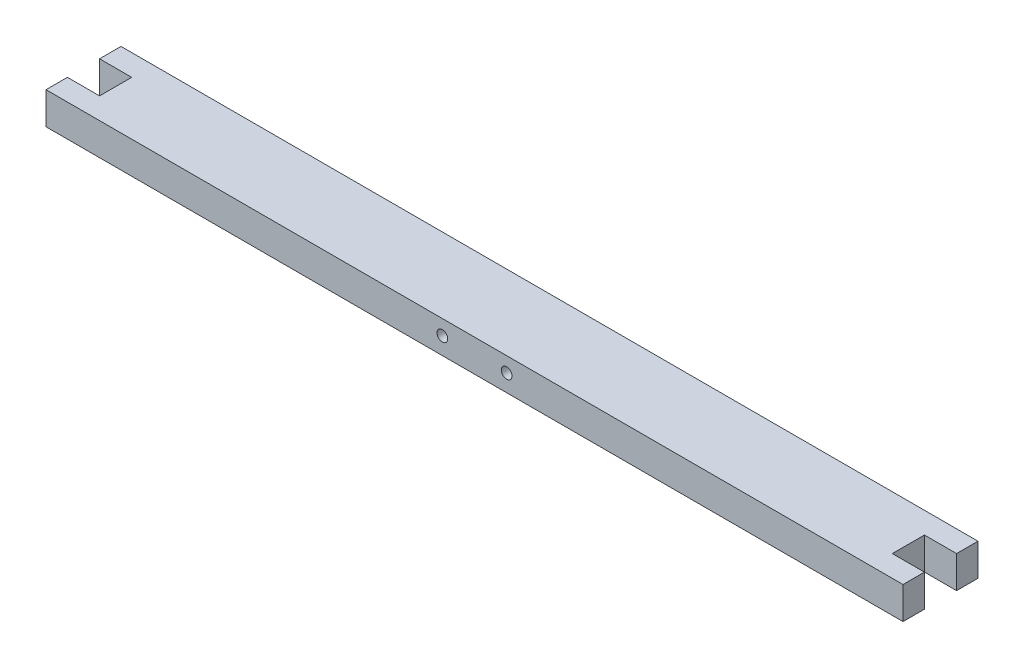
ISO-10303-21;
HEADER;
FILE_DESCRIPTION(('STEP AP214'),'2;1');
FILE_NAME('part.step','',(''),(''),'','','');
FILE_SCHEMA(('AUTOMOTIVE_DESIGN { 1 0 10303 214 1 1 1 1 }'));
ENDSEC;
DATA;
#1=APPLICATION_CONTEXT('core data for automotive mechanical design processes');
#2=APPLICATION_PROTOCOL_DEFINITION('international standard','automotive_design',2000,#1);
#3=PRODUCT_CONTEXT('',#1,'mechanical');
#4=PRODUCT('Part','Part','',(#3));
#5=PRODUCT_RELATED_PRODUCT_CATEGORY('part','',(#4));
#6=PRODUCT_DEFINITION_FORMATION('','',#4);
#7=PRODUCT_DEFINITION_CONTEXT('part definition',#1,'design');
#8=PRODUCT_DEFINITION('design','',#6,#7);
#9=PRODUCT_DEFINITION_SHAPE('','',#8);
#10=(LENGTH_UNIT() NAMED_UNIT(*) SI_UNIT(.MILLI.,.METRE.));
#11=(NAMED_UNIT(*) PLANE_ANGLE_UNIT() SI_UNIT($,.RADIAN.));
#12=(NAMED_UNIT(*) SI_UNIT($,.STERADIAN.) SOLID_ANGLE_UNIT());
#13=UNCERTAINTY_MEASURE_WITH_UNIT(LENGTH_MEASURE(1.E-05),#10,'distance_accuracy_value','');
#14=(GEOMETRIC_REPRESENTATION_CONTEXT(3) GLOBAL_UNCERTAINTY_ASSIGNED_CONTEXT((#13)) GLOBAL_UNIT_ASSIGNED_CONTEXT((#10,
#11,#12)) REPRESENTATION_CONTEXT('',''));
#15=CARTESIAN_POINT('',(0.,0.,0.));
#16=DIRECTION('',(0.,0.,1.));
#17=DIRECTION('',(1.,0.,0.));
#18=AXIS2_PLACEMENT_3D('',#15,#16,#17);
#19=CARTESIAN_POINT('',(0.,15.,-25.));
#20=DIRECTION('',(-1.,0.,0.));
#21=DIRECTION('',(0.,0.,1.));
#22=AXIS2_PLACEMENT_3D('',#19,#20,#21);
#23=PLANE('',#22);
#24=DIRECTION('',(0.,0.,-1.));
#25=VECTOR('',#24,1.);
#26=CARTESIAN_POINT('',(0.,0.,-25.));
#27=LINE('',#26,#25);
#28=CARTESIAN_POINT('',(0.,0.,-25.));
#29=VERTEX_POINT('',#28);
#30=CARTESIAN_POINT('',(0.,0.,-35.));
#31=VERTEX_POINT('',#30);
#32=EDGE_CURVE('E157',#29,#31,#27,.T.);
#33=ORIENTED_EDGE('',*,*,#32,.F.);
#34=DIRECTION('',(0.,-1.,0.));
#35=VECTOR('',#34,1.);
#36=CARTESIAN_POINT('',(0.,15.,-25.));
#37=LINE('',#36,#35);
#38=CARTESIAN_POINT('',(0.,15.,-25.));
#39=VERTEX_POINT('',#38);
#40=EDGE_CURVE('E11',#39,#29,#37,.T.);
#41=ORIENTED_EDGE('',*,*,#40,.F.);
#42=DIRECTION('',(0.,0.,-1.));
#43=VECTOR('',#42,1.);
#44=CARTESIAN_POINT('',(0.,15.,-25.));
#45=LINE('',#44,#43);
#46=CARTESIAN_POINT('',(0.,15.,-35.));
#47=VERTEX_POINT('',#46);
#48=EDGE_CURVE('E186',#39,#47,#45,.T.);
#49=ORIENTED_EDGE('',*,*,#48,.T.);
#50=DIRECTION('',(0.,-1.,0.));
#51=VECTOR('',#50,1.);
#52=CARTESIAN_POINT('',(0.,15.,-35.));
#53=LINE('',#52,#51);
#54=EDGE_CURVE('E38',#47,#31,#53,.T.);
#55=ORIENTED_EDGE('',*,*,#54,.T.);
#56=EDGE_LOOP('',(#33,#41,#49,#55));
#57=FACE_BOUND('',#56,.T.);
#58=ADVANCED_FACE('F35',(#57),#23,.T.);
#59=CARTESIAN_POINT('',(0.,15.,-25.));
#60=DIRECTION('',(0.,0.,-1.));
#61=DIRECTION('',(-1.,0.,0.));
#62=AXIS2_PLACEMENT_3D('',#59,#60,#61);
#63=PLANE('',#62);
#64=DIRECTION('',(1.,0.,0.));
#65=VECTOR('',#64,1.);
#66=CARTESIAN_POINT('',(0.,0.,-25.));
#67=LINE('',#66,#65);
#68=CARTESIAN_POINT('',(15.,0.,-25.));
#69=VERTEX_POINT('',#68);
#70=EDGE_CURVE('E185',#29,#69,#67,.T.);
#71=ORIENTED_EDGE('',*,*,#70,.T.);
#72=DIRECTION('',(0.,-1.,0.));
#73=VECTOR('',#72,1.);
#74=CARTESIAN_POINT('',(15.,15.,-25.));
#75=LINE('',#74,#73);
#76=CARTESIAN_POINT('',(15.,15.,-25.));
#77=VERTEX_POINT('',#76);
#78=EDGE_CURVE('E44',#77,#69,#75,.T.);
#79=ORIENTED_EDGE('',*,*,#78,.F.);
#80=DIRECTION('',(1.,0.,0.));
#81=VECTOR('',#80,1.);
#82=CARTESIAN_POINT('',(0.,15.,-25.));
#83=LINE('',#82,#81);
#84=EDGE_CURVE('E147',#39,#77,#83,.T.);
#85=ORIENTED_EDGE('',*,*,#84,.F.);
#86=ORIENTED_EDGE('',*,*,#40,.T.);
#87=EDGE_LOOP('',(#71,#79,#85,#86));
#88=FACE_BOUND('',#87,.T.);
#89=ADVANCED_FACE('F210',(#88),#63,.F.);
#90=CARTESIAN_POINT('',(15.,15.,-10.));
#91=DIRECTION('',(-1.,0.,0.));
#92=DIRECTION('',(0.,0.,1.));
#93=AXIS2_PLACEMENT_3D('',#90,#91,#92);
#94=PLANE('',#93);
#95=DIRECTION('',(0.,0.,-1.));
#96=VECTOR('',#95,1.);
#97=CARTESIAN_POINT('',(15.,0.,-10.));
#98=LINE('',#97,#96);
#99=CARTESIAN_POINT('',(15.,0.,-10.));
#100=VERTEX_POINT('',#99);
#101=EDGE_CURVE('E133',#100,#69,#98,.T.);
#102=ORIENTED_EDGE('',*,*,#101,.F.);
#103=DIRECTION('',(0.,-1.,0.));
#104=VECTOR('',#103,1.);
#105=CARTESIAN_POINT('',(15.,15.,-10.));
#106=LINE('',#105,#104);
#107=CARTESIAN_POINT('',(15.,15.,-10.));
#108=VERTEX_POINT('',#107);
#109=EDGE_CURVE('E128',#108,#100,#106,.T.);
#110=ORIENTED_EDGE('',*,*,#109,.F.);
#111=DIRECTION('',(0.,0.,-1.));
#112=VECTOR('',#111,1.);
#113=CARTESIAN_POINT('',(15.,15.,-10.));
#114=LINE('',#113,#112);
#115=EDGE_CURVE('E131',#108,#77,#114,.T.);
#116=ORIENTED_EDGE('',*,*,#115,.T.);
#117=ORIENTED_EDGE('',*,*,#78,.T.);
#118=EDGE_LOOP('',(#102,#110,#116,#117));
#119=FACE_BOUND('',#118,.T.);
#120=ADVANCED_FACE('F130',(#119),#94,.T.);
#121=CARTESIAN_POINT('',(0.,15.,-10.));
#122=DIRECTION('',(0.,0.,-1.));
#123=DIRECTION('',(-1.,0.,0.));
#124=AXIS2_PLACEMENT_3D('',#121,#122,#123);
#125=PLANE('',#124);
#126=DIRECTION('',(1.,0.,0.));
#127=VECTOR('',#126,1.);
#128=CARTESIAN_POINT('',(0.,0.,-10.));
#129=LINE('',#128,#127);
#130=CARTESIAN_POINT('',(0.,0.,-10.));
#131=VERTEX_POINT('',#130);
#132=EDGE_CURVE('E182',#131,#100,#129,.T.);
#133=ORIENTED_EDGE('',*,*,#132,.F.);
#134=DIRECTION('',(0.,-1.,0.));
#135=VECTOR('',#134,1.);
#136=CARTESIAN_POINT('',(0.,15.,-10.));
#137=LINE('',#136,#135);
#138=CARTESIAN_POINT('',(0.,15.,-10.));
#139=VERTEX_POINT('',#138);
#140=EDGE_CURVE('E138',#139,#131,#137,.T.);
#141=ORIENTED_EDGE('',*,*,#140,.F.);
#142=DIRECTION('',(1.,0.,0.));
#143=VECTOR('',#142,1.);
#144=CARTESIAN_POINT('',(0.,15.,-10.));
#145=LINE('',#144,#143);
#146=EDGE_CURVE('E145',#139,#108,#145,.T.);
#147=ORIENTED_EDGE('',*,*,#146,.T.);
#148=ORIENTED_EDGE('',*,*,#109,.T.);
#149=EDGE_LOOP('',(#133,#141,#147,#148));
#150=FACE_BOUND('',#149,.T.);
#151=ADVANCED_FACE('F149',(#150),#125,.T.);
#152=CARTESIAN_POINT('',(0.,15.,0.));
#153=DIRECTION('',(-1.,0.,0.));
#154=DIRECTION('',(0.,0.,1.));
#155=AXIS2_PLACEMENT_3D('',#152,#153,#154);
#156=PLANE('',#155);
#157=DIRECTION('',(0.,0.,-1.));
#158=VECTOR('',#157,1.);
#159=CARTESIAN_POINT('',(0.,0.,0.));
#160=LINE('',#159,#158);
#161=CARTESIAN_POINT('',(0.,0.,0.));
#162=VERTEX_POINT('',#161);
#163=EDGE_CURVE('E179',#162,#131,#160,.T.);
#164=ORIENTED_EDGE('',*,*,#163,.F.);
#165=DIRECTION('',(0.,-1.,0.));
#166=VECTOR('',#165,1.);
#167=CARTESIAN_POINT('',(0.,15.,0.));
#168=LINE('',#167,#166);
#169=CARTESIAN_POINT('',(0.,15.,0.));
#170=VERTEX_POINT('',#169);
#171=EDGE_CURVE('E190',#170,#162,#168,.T.);
#172=ORIENTED_EDGE('',*,*,#171,.F.);
#173=DIRECTION('',(0.,0.,-1.));
#174=VECTOR('',#173,1.);
#175=CARTESIAN_POINT('',(0.,15.,0.));
#176=LINE('',#175,#174);
#177=EDGE_CURVE('E150',#170,#139,#176,.T.);
#178=ORIENTED_EDGE('',*,*,#177,.T.);
#179=ORIENTED_EDGE('',*,*,#140,.T.);
#180=EDGE_LOOP('',(#164,#172,#178,#179));
#181=FACE_BOUND('',#180,.T.);
#182=ADVANCED_FACE('F257',(#181),#156,.T.);
#183=CARTESIAN_POINT('',(0.,15.,0.));
#184=DIRECTION('',(0.,0.,-1.));
#185=DIRECTION('',(-1.,0.,0.));
#186=AXIS2_PLACEMENT_3D('',#183,#184,#185);
#187=PLANE('',#186);
#188=CARTESIAN_POINT('',(185.,8.00000000000001,0.));
#189=DIRECTION('',(0.,0.,1.));
#190=DIRECTION('',(1.,0.,0.));
#191=AXIS2_PLACEMENT_3D('',#188,#189,#190);
#192=CIRCLE('',#191,2.5);
#193=CARTESIAN_POINT('',(187.5,8.00000000000001,0.));
#194=VERTEX_POINT('',#193);
#195=EDGE_CURVE('E295',#194,#194,#192,.T.);
#196=ORIENTED_EDGE('',*,*,#195,.F.);
#197=EDGE_LOOP('',(#196));
#198=FACE_BOUND('',#197,.T.);
#199=CARTESIAN_POINT('',(215.,8.00000000000001,0.));
#200=DIRECTION('',(0.,0.,1.));
#201=DIRECTION('',(1.,0.,0.));
#202=AXIS2_PLACEMENT_3D('',#199,#200,#201);
#203=CIRCLE('',#202,2.50000000000002);
#204=CARTESIAN_POINT('',(217.5,8.00000000000001,0.));
#205=VERTEX_POINT('',#204);
#206=EDGE_CURVE('E216',#205,#205,#203,.T.);
#207=ORIENTED_EDGE('',*,*,#206,.F.);
#208=EDGE_LOOP('',(#207));
#209=FACE_BOUND('',#208,.T.);
#210=DIRECTION('',(1.,0.,0.));
#211=VECTOR('',#210,1.);
#212=CARTESIAN_POINT('',(0.,0.,0.));
#213=LINE('',#212,#211);
#214=CARTESIAN_POINT('',(400.,0.,1.01307850997046E-13));
#215=VERTEX_POINT('',#214);
#216=EDGE_CURVE('E177',#162,#215,#213,.T.);
#217=ORIENTED_EDGE('',*,*,#216,.T.);
#218=DIRECTION('',(0.,-1.,0.));
#219=VECTOR('',#218,1.);
#220=CARTESIAN_POINT('',(400.,15.,1.01307850997046E-13));
#221=LINE('',#220,#219);
#222=CARTESIAN_POINT('',(400.,15.,1.01307850997046E-13));
#223=VERTEX_POINT('',#222);
#224=EDGE_CURVE('E192',#223,#215,#221,.T.);
#225=ORIENTED_EDGE('',*,*,#224,.F.);
#226=DIRECTION('',(1.,0.,0.));
#227=VECTOR('',#226,1.);
#228=CARTESIAN_POINT('',(0.,15.,0.));
#229=LINE('',#228,#227);
#230=EDGE_CURVE('E152',#170,#223,#229,.T.);
#231=ORIENTED_EDGE('',*,*,#230,.F.);
#232=ORIENTED_EDGE('',*,*,#171,.T.);
#233=EDGE_LOOP('',(#217,#225,#231,#232));
#234=FACE_BOUND('',#233,.T.);
#235=ADVANCED_FACE('F233',(#198,#209,#234),#187,.F.);
#236=CARTESIAN_POINT('',(400.,15.,1.01307850997046E-13));
#237=DIRECTION('',(-1.,0.,0.));
#238=DIRECTION('',(0.,0.,1.));
#239=AXIS2_PLACEMENT_3D('',#236,#237,#238);
#240=PLANE('',#239);
#241=DIRECTION('',(0.,0.,-1.));
#242=VECTOR('',#241,1.);
#243=CARTESIAN_POINT('',(400.,0.,1.01307850997046E-13));
#244=LINE('',#243,#242);
#245=CARTESIAN_POINT('',(400.,0.,-9.9999999999999));
#246=VERTEX_POINT('',#245);
#247=EDGE_CURVE('E175',#215,#246,#244,.T.);
#248=ORIENTED_EDGE('',*,*,#247,.T.);
#249=DIRECTION('',(0.,-1.,0.));
#250=VECTOR('',#249,1.);
#251=CARTESIAN_POINT('',(400.,15.,-9.9999999999999));
#252=LINE('',#251,#250);
#253=CARTESIAN_POINT('',(400.,15.,-9.9999999999999));
#254=VERTEX_POINT('',#253);
#255=EDGE_CURVE('E195',#254,#246,#252,.T.);
#256=ORIENTED_EDGE('',*,*,#255,.F.);
#257=DIRECTION('',(0.,0.,-1.));
#258=VECTOR('',#257,1.);
#259=CARTESIAN_POINT('',(400.,15.,1.01307850997046E-13));
#260=LINE('',#259,#258);
#261=EDGE_CURVE('E227',#223,#254,#260,.T.);
#262=ORIENTED_EDGE('',*,*,#261,.F.);
#263=ORIENTED_EDGE('',*,*,#224,.T.);
#264=EDGE_LOOP('',(#248,#256,#262,#263));
#265=FACE_BOUND('',#264,.T.);
#266=ADVANCED_FACE('F237',(#265),#240,.F.);
#267=CARTESIAN_POINT('',(400.,15.,-9.9999999999999));
#268=DIRECTION('',(0.,0.,1.));
#269=DIRECTION('',(1.,0.,0.));
#270=AXIS2_PLACEMENT_3D('',#267,#268,#269);
#271=PLANE('',#270);
#272=DIRECTION('',(-1.,0.,0.));
#273=VECTOR('',#272,1.);
#274=CARTESIAN_POINT('',(400.,0.,-9.9999999999999));
#275=LINE('',#274,#273);
#276=CARTESIAN_POINT('',(385.,0.,-9.9999999999999));
#277=VERTEX_POINT('',#276);
#278=EDGE_CURVE('E173',#246,#277,#275,.T.);
#279=ORIENTED_EDGE('',*,*,#278,.T.);
#280=DIRECTION('',(0.,-1.,0.));
#281=VECTOR('',#280,1.);
#282=CARTESIAN_POINT('',(385.,15.,-9.9999999999999));
#283=LINE('',#282,#281);
#284=CARTESIAN_POINT('',(385.,15.,-9.9999999999999));
#285=VERTEX_POINT('',#284);
#286=EDGE_CURVE('E198',#285,#277,#283,.T.);
#287=ORIENTED_EDGE('',*,*,#286,.F.);
#288=DIRECTION('',(-1.,0.,0.));
#289=VECTOR('',#288,1.);
#290=CARTESIAN_POINT('',(400.,15.,-9.9999999999999));
#291=LINE('',#290,#289);
#292=EDGE_CURVE('E225',#254,#285,#291,.T.);
#293=ORIENTED_EDGE('',*,*,#292,.F.);
#294=ORIENTED_EDGE('',*,*,#255,.T.);
#295=EDGE_LOOP('',(#279,#287,#293,#294));
#296=FACE_BOUND('',#295,.T.);
#297=ADVANCED_FACE('F242',(#296),#271,.F.);
#298=CARTESIAN_POINT('',(385.,15.,-9.9999999999999));
#299=DIRECTION('',(-1.,0.,0.));
#300=DIRECTION('',(0.,0.,1.));
#301=AXIS2_PLACEMENT_3D('',#298,#299,#300);
#302=PLANE('',#301);
#303=DIRECTION('',(0.,0.,-1.));
#304=VECTOR('',#303,1.);
#305=CARTESIAN_POINT('',(385.,0.,-9.9999999999999));
#306=LINE('',#305,#304);
#307=CARTESIAN_POINT('',(385.,0.,-24.9999999999999));
#308=VERTEX_POINT('',#307);
#309=EDGE_CURVE('E170',#277,#308,#306,.T.);
#310=ORIENTED_EDGE('',*,*,#309,.T.);
#311=DIRECTION('',(0.,-1.,0.));
#312=VECTOR('',#311,1.);
#313=CARTESIAN_POINT('',(385.,15.,-24.9999999999999));
#314=LINE('',#313,#312);
#315=CARTESIAN_POINT('',(385.,15.,-24.9999999999999));
#316=VERTEX_POINT('',#315);
#317=EDGE_CURVE('E201',#316,#308,#314,.T.);
#318=ORIENTED_EDGE('',*,*,#317,.F.);
#319=DIRECTION('',(0.,0.,-1.));
#320=VECTOR('',#319,1.);
#321=CARTESIAN_POINT('',(385.,15.,-9.9999999999999));
#322=LINE('',#321,#320);
#323=EDGE_CURVE('E223',#285,#316,#322,.T.);
#324=ORIENTED_EDGE('',*,*,#323,.F.);
#325=ORIENTED_EDGE('',*,*,#286,.T.);
#326=EDGE_LOOP('',(#310,#318,#324,#325));
#327=FACE_BOUND('',#326,.T.);
#328=ADVANCED_FACE('F247',(#327),#302,.F.);
#329=CARTESIAN_POINT('',(400.,15.,-24.9999999999999));
#330=DIRECTION('',(0.,0.,1.));
#331=DIRECTION('',(1.,0.,0.));
#332=AXIS2_PLACEMENT_3D('',#329,#330,#331);
#333=PLANE('',#332);
#334=DIRECTION('',(-1.,0.,0.));
#335=VECTOR('',#334,1.);
#336=CARTESIAN_POINT('',(400.,0.,-24.9999999999999));
#337=LINE('',#336,#335);
#338=CARTESIAN_POINT('',(400.,0.,-24.9999999999999));
#339=VERTEX_POINT('',#338);
#340=EDGE_CURVE('E167',#339,#308,#337,.T.);
#341=ORIENTED_EDGE('',*,*,#340,.F.);
#342=DIRECTION('',(0.,-1.,0.));
#343=VECTOR('',#342,1.);
#344=CARTESIAN_POINT('',(400.,15.,-24.9999999999999));
#345=LINE('',#344,#343);
#346=CARTESIAN_POINT('',(400.,15.,-24.9999999999999));
#347=VERTEX_POINT('',#346);
#348=EDGE_CURVE('E203',#347,#339,#345,.T.);
#349=ORIENTED_EDGE('',*,*,#348,.F.);
#350=DIRECTION('',(-1.,0.,0.));
#351=VECTOR('',#350,1.);
#352=CARTESIAN_POINT('',(400.,15.,-24.9999999999999));
#353=LINE('',#352,#351);
#354=EDGE_CURVE('E220',#347,#316,#353,.T.);
#355=ORIENTED_EDGE('',*,*,#354,.T.);
#356=ORIENTED_EDGE('',*,*,#317,.T.);
#357=EDGE_LOOP('',(#341,#349,#355,#356));
#358=FACE_BOUND('',#357,.T.);
#359=ADVANCED_FACE('F251',(#358),#333,.T.);
#360=CARTESIAN_POINT('',(400.,15.,-24.9999999999999));
#361=DIRECTION('',(-1.,0.,0.));
#362=DIRECTION('',(0.,0.,1.));
#363=AXIS2_PLACEMENT_3D('',#360,#361,#362);
#364=PLANE('',#363);
#365=DIRECTION('',(0.,0.,-1.));
#366=VECTOR('',#365,1.);
#367=CARTESIAN_POINT('',(400.,0.,-24.9999999999999));
#368=LINE('',#367,#366);
#369=CARTESIAN_POINT('',(400.,0.,-34.9999999999999));
#370=VERTEX_POINT('',#369);
#371=EDGE_CURVE('E164',#339,#370,#368,.T.);
#372=ORIENTED_EDGE('',*,*,#371,.T.);
#373=DIRECTION('',(0.,-1.,0.));
#374=VECTOR('',#373,1.);
#375=CARTESIAN_POINT('',(400.,15.,-34.9999999999999));
#376=LINE('',#375,#374);
#377=CARTESIAN_POINT('',(400.,15.,-34.9999999999999));
#378=VERTEX_POINT('',#377);
#379=EDGE_CURVE('E204',#378,#370,#376,.T.);
#380=ORIENTED_EDGE('',*,*,#379,.F.);
#381=DIRECTION('',(0.,0.,-1.));
#382=VECTOR('',#381,1.);
#383=CARTESIAN_POINT('',(400.,15.,-24.9999999999999));
#384=LINE('',#383,#382);
#385=EDGE_CURVE('E213',#347,#378,#384,.T.);
#386=ORIENTED_EDGE('',*,*,#385,.F.);
#387=ORIENTED_EDGE('',*,*,#348,.T.);
#388=EDGE_LOOP('',(#372,#380,#386,#387));
#389=FACE_BOUND('',#388,.T.);
#390=ADVANCED_FACE('F254',(#389),#364,.F.);
#391=CARTESIAN_POINT('',(0.,15.,-35.));
#392=DIRECTION('',(0.,0.,-1.));
#393=DIRECTION('',(-1.,0.,0.));
#394=AXIS2_PLACEMENT_3D('',#391,#392,#393);
#395=PLANE('',#394);
#396=CARTESIAN_POINT('',(185.,8.00000000000001,-35.));
#397=DIRECTION('',(0.,0.,1.));
#398=DIRECTION('',(1.,0.,0.));
#399=AXIS2_PLACEMENT_3D('',#396,#397,#398);
#400=CIRCLE('',#399,2.5);
#401=CARTESIAN_POINT('',(187.5,8.00000000000001,-35.));
#402=VERTEX_POINT('',#401);
#403=EDGE_CURVE('E161',#402,#402,#400,.T.);
#404=ORIENTED_EDGE('',*,*,#403,.T.);
#405=EDGE_LOOP('',(#404));
#406=FACE_BOUND('',#405,.T.);
#407=CARTESIAN_POINT('',(215.,8.00000000000001,-35.));
#408=DIRECTION('',(0.,0.,1.));
#409=DIRECTION('',(1.,0.,0.));
#410=AXIS2_PLACEMENT_3D('',#407,#408,#409);
#411=CIRCLE('',#410,2.50000000000002);
#412=CARTESIAN_POINT('',(217.5,8.00000000000001,-35.));
#413=VERTEX_POINT('',#412);
#414=EDGE_CURVE('E296',#413,#413,#411,.T.);
#415=ORIENTED_EDGE('',*,*,#414,.T.);
#416=EDGE_LOOP('',(#415));
#417=FACE_BOUND('',#416,.T.);
#418=DIRECTION('',(1.,0.,0.));
#419=VECTOR('',#418,1.);
#420=CARTESIAN_POINT('',(0.,0.,-35.));
#421=LINE('',#420,#419);
#422=EDGE_CURVE('E160',#31,#370,#421,.T.);
#423=ORIENTED_EDGE('',*,*,#422,.F.);
#424=ORIENTED_EDGE('',*,*,#54,.F.);
#425=DIRECTION('',(1.,0.,0.));
#426=VECTOR('',#425,1.);
#427=CARTESIAN_POINT('',(0.,15.,-35.));
#428=LINE('',#427,#426);
#429=EDGE_CURVE('E211',#47,#378,#428,.T.);
#430=ORIENTED_EDGE('',*,*,#429,.T.);
#431=ORIENTED_EDGE('',*,*,#379,.T.);
#432=EDGE_LOOP('',(#423,#424,#430,#431));
#433=FACE_BOUND('',#432,.T.);
#434=ADVANCED_FACE('F206',(#406,#417,#433),#395,.T.);
#435=CARTESIAN_POINT('',(0.,15.,0.));
#436=DIRECTION('',(0.,-1.,0.));
#437=DIRECTION('',(0.,0.,-1.));
#438=AXIS2_PLACEMENT_3D('',#435,#436,#437);
#439=PLANE('',#438);
#440=ORIENTED_EDGE('',*,*,#48,.F.);
#441=ORIENTED_EDGE('',*,*,#84,.T.);
#442=ORIENTED_EDGE('',*,*,#115,.F.);
#443=ORIENTED_EDGE('',*,*,#146,.F.);
#444=ORIENTED_EDGE('',*,*,#177,.F.);
#445=ORIENTED_EDGE('',*,*,#230,.T.);
#446=ORIENTED_EDGE('',*,*,#261,.T.);
#447=ORIENTED_EDGE('',*,*,#292,.T.);
#448=ORIENTED_EDGE('',*,*,#323,.T.);
#449=ORIENTED_EDGE('',*,*,#354,.F.);
#450=ORIENTED_EDGE('',*,*,#385,.T.);
#451=ORIENTED_EDGE('',*,*,#429,.F.);
#452=EDGE_LOOP('',(#440,#441,#442,#443,#444,#445,#446,#447,#448,#449,#450,#451));
#453=FACE_BOUND('',#452,.T.);
#454=ADVANCED_FACE('F143',(#453),#439,.F.);
#455=CARTESIAN_POINT('',(0.,0.,0.));
#456=DIRECTION('',(0.,-1.,0.));
#457=DIRECTION('',(0.,0.,-1.));
#458=AXIS2_PLACEMENT_3D('',#455,#456,#457);
#459=PLANE('',#458);
#460=ORIENTED_EDGE('',*,*,#32,.T.);
#461=ORIENTED_EDGE('',*,*,#422,.T.);
#462=ORIENTED_EDGE('',*,*,#371,.F.);
#463=ORIENTED_EDGE('',*,*,#340,.T.);
#464=ORIENTED_EDGE('',*,*,#309,.F.);
#465=ORIENTED_EDGE('',*,*,#278,.F.);
#466=ORIENTED_EDGE('',*,*,#247,.F.);
#467=ORIENTED_EDGE('',*,*,#216,.F.);
#468=ORIENTED_EDGE('',*,*,#163,.T.);
#469=ORIENTED_EDGE('',*,*,#132,.T.);
#470=ORIENTED_EDGE('',*,*,#101,.T.);
#471=ORIENTED_EDGE('',*,*,#70,.F.);
#472=EDGE_LOOP('',(#460,#461,#462,#463,#464,#465,#466,#467,#468,#469,#470,#471));
#473=FACE_BOUND('',#472,.T.);
#474=ADVANCED_FACE('F209',(#473),#459,.T.);
#475=CARTESIAN_POINT('',(215.,8.00000000000001,-35.));
#476=DIRECTION('',(0.,0.,1.));
#477=DIRECTION('',(1.,0.,0.));
#478=AXIS2_PLACEMENT_3D('',#475,#476,#477);
#479=CYLINDRICAL_SURFACE('',#478,2.50000000000002);
#480=ORIENTED_EDGE('',*,*,#414,.F.);
#481=EDGE_LOOP('',(#480));
#482=FACE_BOUND('',#481,.T.);
#483=ORIENTED_EDGE('',*,*,#206,.T.);
#484=EDGE_LOOP('',(#483));
#485=FACE_BOUND('',#484,.T.);
#486=ADVANCED_FACE('F279',(#482,#485),#479,.F.);
#487=CARTESIAN_POINT('',(185.,8.00000000000001,-35.));
#488=DIRECTION('',(0.,0.,1.));
#489=DIRECTION('',(1.,0.,0.));
#490=AXIS2_PLACEMENT_3D('',#487,#488,#489);
#491=CYLINDRICAL_SURFACE('',#490,2.5);
#492=ORIENTED_EDGE('',*,*,#403,.F.);
#493=EDGE_LOOP('',(#492));
#494=FACE_BOUND('',#493,.T.);
#495=ORIENTED_EDGE('',*,*,#195,.T.);
#496=EDGE_LOOP('',(#495));
#497=FACE_BOUND('',#496,.T.);
#498=ADVANCED_FACE('F284',(#494,#497),#491,.F.);
#499=CLOSED_SHELL('',(#58,#89,#120,#151,#182,#235,#266,#297,#328,#359,#390,#434,#454,#474,#486,#498));
#500=MANIFOLD_SOLID_BREP('B2',#499);
#501=ADVANCED_BREP_SHAPE_REPRESENTATION('',(#18,#500),#14);
#502=SHAPE_DEFINITION_REPRESENTATION(#9,#501);
ENDSEC;
END-ISO-10303-21;
